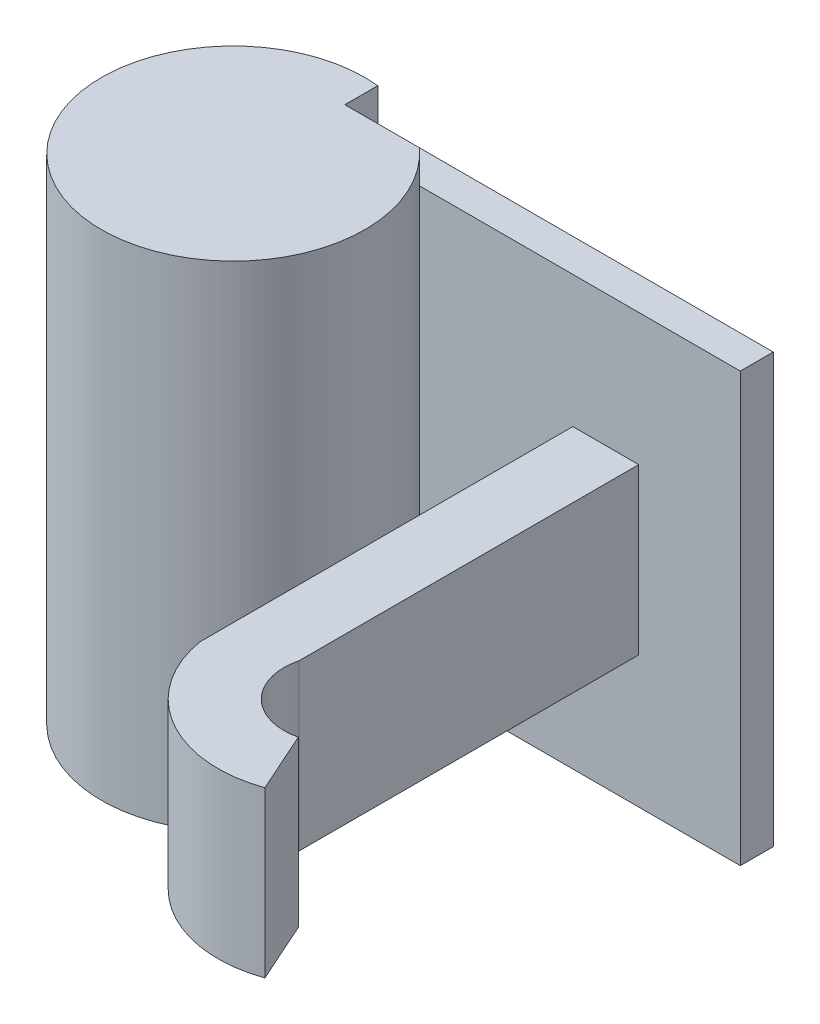
ISO-10303-21;
HEADER;
FILE_DESCRIPTION(('STEP AP214'),'2;1');
FILE_NAME('part.step','',(''),(''),'','','');
FILE_SCHEMA(('AUTOMOTIVE_DESIGN { 1 0 10303 214 1 1 1 1 }'));
ENDSEC;
DATA;
#1=APPLICATION_CONTEXT('core data for automotive mechanical design processes');
#2=APPLICATION_PROTOCOL_DEFINITION('international standard','automotive_design',2000,#1);
#3=PRODUCT_CONTEXT('',#1,'mechanical');
#4=PRODUCT('Part','Part','',(#3));
#5=PRODUCT_RELATED_PRODUCT_CATEGORY('part','',(#4));
#6=PRODUCT_DEFINITION_FORMATION('','',#4);
#7=PRODUCT_DEFINITION_CONTEXT('part definition',#1,'design');
#8=PRODUCT_DEFINITION('design','',#6,#7);
#9=PRODUCT_DEFINITION_SHAPE('','',#8);
#10=(LENGTH_UNIT() NAMED_UNIT(*) SI_UNIT(.MILLI.,.METRE.));
#11=(NAMED_UNIT(*) PLANE_ANGLE_UNIT() SI_UNIT($,.RADIAN.));
#12=(NAMED_UNIT(*) SI_UNIT($,.STERADIAN.) SOLID_ANGLE_UNIT());
#13=UNCERTAINTY_MEASURE_WITH_UNIT(LENGTH_MEASURE(1.E-05),#10,'distance_accuracy_value','');
#14=(GEOMETRIC_REPRESENTATION_CONTEXT(3) GLOBAL_UNCERTAINTY_ASSIGNED_CONTEXT((#13)) GLOBAL_UNIT_ASSIGNED_CONTEXT((#10,
#11,#12)) REPRESENTATION_CONTEXT('',''));
#15=CARTESIAN_POINT('',(0.,0.,0.));
#16=DIRECTION('',(0.,0.,1.));
#17=DIRECTION('',(1.,0.,0.));
#18=AXIS2_PLACEMENT_3D('',#15,#16,#17);
#19=CARTESIAN_POINT('',(-30.5087679770736,15.,-45.2098275623858));
#20=DIRECTION('',(0.,-1.,0.));
#21=DIRECTION('',(0.,0.,-1.));
#22=AXIS2_PLACEMENT_3D('',#19,#20,#21);
#23=CYLINDRICAL_SURFACE('',#22,4.);
#24=CARTESIAN_POINT('',(-30.5087679770736,0.,-45.2098275623858));
#25=DIRECTION('',(0.,1.,0.));
#26=DIRECTION('',(0.,0.,1.));
#27=AXIS2_PLACEMENT_3D('',#24,#25,#26);
#28=CIRCLE('',#27,4.);
#29=CARTESIAN_POINT('',(-30.0975241662523,0.,-49.1886312177653));
#30=VERTEX_POINT('',#29);
#31=CARTESIAN_POINT('',(-27.8391746030374,0.,-48.1886312177653));
#32=VERTEX_POINT('',#31);
#33=EDGE_CURVE('E205',#30,#32,#28,.T.);
#34=ORIENTED_EDGE('',*,*,#33,.T.);
#35=DIRECTION('',(0.,-1.,0.));
#36=VECTOR('',#35,1.);
#37=CARTESIAN_POINT('',(-27.8391746030374,15.,-48.1886312177653));
#38=LINE('',#37,#36);
#39=CARTESIAN_POINT('',(-27.8391746030374,1.,-48.1886312177653));
#40=VERTEX_POINT('',#39);
#41=EDGE_CURVE('E57',#40,#32,#38,.T.);
#42=ORIENTED_EDGE('',*,*,#41,.F.);
#43=DIRECTION('',(0.,-1.,0.));
#44=VECTOR('',#43,1.);
#45=CARTESIAN_POINT('',(-27.8391746030374,15.,-48.1886312177653));
#46=LINE('',#45,#44);
#47=CARTESIAN_POINT('',(-27.8391746030374,14.,-48.1886312177653));
#48=VERTEX_POINT('',#47);
#49=EDGE_CURVE('E162',#48,#40,#46,.T.);
#50=ORIENTED_EDGE('',*,*,#49,.F.);
#51=CARTESIAN_POINT('',(-27.8391746030374,15.,-48.1886312177653));
#52=VERTEX_POINT('',#51);
#53=EDGE_CURVE('E43',#52,#48,#46,.T.);
#54=ORIENTED_EDGE('',*,*,#53,.F.);
#55=CARTESIAN_POINT('',(-30.5087679770736,15.,-45.2098275623858));
#56=DIRECTION('',(0.,1.,0.));
#57=DIRECTION('',(0.,0.,1.));
#58=AXIS2_PLACEMENT_3D('',#55,#56,#57);
#59=CIRCLE('',#58,4.);
#60=CARTESIAN_POINT('',(-30.0975241662523,15.,-49.1886312177653));
#61=VERTEX_POINT('',#60);
#62=EDGE_CURVE('E208',#61,#52,#59,.T.);
#63=ORIENTED_EDGE('',*,*,#62,.F.);
#64=DIRECTION('',(0.,-1.,0.));
#65=VECTOR('',#64,1.);
#66=CARTESIAN_POINT('',(-30.0975241662523,15.,-49.1886312177653));
#67=LINE('',#66,#65);
#68=CARTESIAN_POINT('',(-30.0975241662523,14.,-49.1886312177653));
#69=VERTEX_POINT('',#68);
#70=EDGE_CURVE('E212',#61,#69,#67,.T.);
#71=ORIENTED_EDGE('',*,*,#70,.T.);
#72=CARTESIAN_POINT('',(-30.0975241662523,1.,-49.1886312177653));
#73=VERTEX_POINT('',#72);
#74=EDGE_CURVE('E210',#69,#73,#67,.T.);
#75=ORIENTED_EDGE('',*,*,#74,.T.);
#76=DIRECTION('',(0.,1.,0.));
#77=VECTOR('',#76,1.);
#78=CARTESIAN_POINT('',(-30.0975241662523,1.,-49.1886312177653));
#79=LINE('',#78,#77);
#80=EDGE_CURVE('E251',#30,#73,#79,.T.);
#81=ORIENTED_EDGE('',*,*,#80,.F.);
#82=EDGE_LOOP('',(#34,#42,#50,#54,#63,#71,#75,#81));
#83=FACE_BOUND('',#82,.T.);
#84=ADVANCED_FACE('F36',(#83),#23,.T.);
#85=CARTESIAN_POINT('',(-23.1795308481363,15.,0.));
#86=DIRECTION('',(1.,0.,0.));
#87=DIRECTION('',(0.,0.,-1.));
#88=AXIS2_PLACEMENT_3D('',#85,#86,#87);
#89=PLANE('',#88);
#90=DIRECTION('',(0.,-1.,0.));
#91=VECTOR('',#90,1.);
#92=CARTESIAN_POINT('',(-23.1795308481363,15.,-48.1886312177653));
#93=LINE('',#92,#91);
#94=CARTESIAN_POINT('',(-23.1795308481363,10.,-48.1886312177653));
#95=VERTEX_POINT('',#94);
#96=CARTESIAN_POINT('',(-23.1795308481363,5.,-48.1886312177653));
#97=VERTEX_POINT('',#96);
#98=EDGE_CURVE('E154',#95,#97,#93,.T.);
#99=ORIENTED_EDGE('',*,*,#98,.T.);
#100=DIRECTION('',(0.,0.,1.));
#101=VECTOR('',#100,1.);
#102=CARTESIAN_POINT('',(-23.1795308481363,5.,0.));
#103=LINE('',#102,#101);
#104=CARTESIAN_POINT('',(-23.1795308481363,5.,-36.8699873289625));
#105=VERTEX_POINT('',#104);
#106=EDGE_CURVE('E135',#97,#105,#103,.T.);
#107=ORIENTED_EDGE('',*,*,#106,.T.);
#108=DIRECTION('',(0.,-1.,0.));
#109=VECTOR('',#108,1.);
#110=CARTESIAN_POINT('',(-23.1795308481363,15.,-36.8699873289625));
#111=LINE('',#110,#109);
#112=CARTESIAN_POINT('',(-23.1795308481363,10.,-36.8699873289625));
#113=VERTEX_POINT('',#112);
#114=EDGE_CURVE('E163',#113,#105,#111,.T.);
#115=ORIENTED_EDGE('',*,*,#114,.F.);
#116=DIRECTION('',(0.,0.,-1.));
#117=VECTOR('',#116,1.);
#118=CARTESIAN_POINT('',(-23.1795308481363,10.,0.));
#119=LINE('',#118,#117);
#120=EDGE_CURVE('E161',#113,#95,#119,.T.);
#121=ORIENTED_EDGE('',*,*,#120,.T.);
#122=EDGE_LOOP('',(#99,#107,#115,#121));
#123=FACE_BOUND('',#122,.T.);
#124=ADVANCED_FACE('F160',(#123),#89,.F.);
#125=CARTESIAN_POINT('',(-19.5742871097638,15.,-37.4717902853478));
#126=DIRECTION('',(0.,-1.,0.));
#127=DIRECTION('',(0.,0.,-1.));
#128=AXIS2_PLACEMENT_3D('',#125,#126,#127);
#129=CYLINDRICAL_SURFACE('',#128,3.65512642891978);
#130=ORIENTED_EDGE('',*,*,#114,.T.);
#131=CARTESIAN_POINT('',(-19.5742871097638,5.,-37.4717902853478));
#132=DIRECTION('',(0.,1.,0.));
#133=DIRECTION('',(-1.,0.,0.));
#134=AXIS2_PLACEMENT_3D('',#131,#132,#133);
#135=CIRCLE('',#134,3.65512642891978);
#136=CARTESIAN_POINT('',(-18.3601178384295,5.,-34.0242198086302));
#137=VERTEX_POINT('',#136);
#138=EDGE_CURVE('E141',#105,#137,#135,.T.);
#139=ORIENTED_EDGE('',*,*,#138,.T.);
#140=DIRECTION('',(0.,-1.,0.));
#141=VECTOR('',#140,1.);
#142=CARTESIAN_POINT('',(-18.3601178384295,15.,-34.0242198086302));
#143=LINE('',#142,#141);
#144=CARTESIAN_POINT('',(-18.3601178384295,10.,-34.0242198086302));
#145=VERTEX_POINT('',#144);
#146=EDGE_CURVE('E166',#145,#137,#143,.T.);
#147=ORIENTED_EDGE('',*,*,#146,.F.);
#148=CARTESIAN_POINT('',(-19.5742871097638,10.,-37.4717902853478));
#149=DIRECTION('',(0.,-1.,0.));
#150=DIRECTION('',(0.,0.,-1.));
#151=AXIS2_PLACEMENT_3D('',#148,#149,#150);
#152=CIRCLE('',#151,3.65512642891978);
#153=EDGE_CURVE('E237',#145,#113,#152,.T.);
#154=ORIENTED_EDGE('',*,*,#153,.T.);
#155=EDGE_LOOP('',(#130,#139,#147,#154));
#156=FACE_BOUND('',#155,.T.);
#157=ADVANCED_FACE('F236',(#156),#129,.T.);
#158=CARTESIAN_POINT('',(-2.59800406845812,15.,1.16375098584307));
#159=DIRECTION('',(0.912623564366042,0.,-0.408800965952651));
#160=DIRECTION('',(-0.408800965952651,0.,-0.912623564366042));
#161=AXIS2_PLACEMENT_3D('',#158,#159,#160);
#162=PLANE('',#161);
#163=DIRECTION('',(0.408800965952651,0.,0.912623564366042));
#164=VECTOR('',#163,1.);
#165=CARTESIAN_POINT('',(-2.59800406845812,5.,1.16375098584307));
#166=LINE('',#165,#164);
#167=CARTESIAN_POINT('',(-19.1832988931057,5.,-35.8619219933266));
#168=VERTEX_POINT('',#167);
#169=EDGE_CURVE('E232',#168,#137,#166,.T.);
#170=ORIENTED_EDGE('',*,*,#169,.F.);
#171=DIRECTION('',(0.,-1.,0.));
#172=VECTOR('',#171,1.);
#173=CARTESIAN_POINT('',(-19.1832988931057,15.,-35.8619219933266));
#174=LINE('',#173,#172);
#175=CARTESIAN_POINT('',(-19.1832988931057,10.,-35.8619219933266));
#176=VERTEX_POINT('',#175);
#177=EDGE_CURVE('E223',#176,#168,#174,.T.);
#178=ORIENTED_EDGE('',*,*,#177,.F.);
#179=DIRECTION('',(-0.408800965952651,0.,-0.912623564366042));
#180=VECTOR('',#179,1.);
#181=CARTESIAN_POINT('',(-2.59800406845812,10.,1.16375098584307));
#182=LINE('',#181,#180);
#183=EDGE_CURVE('E233',#145,#176,#182,.T.);
#184=ORIENTED_EDGE('',*,*,#183,.F.);
#185=ORIENTED_EDGE('',*,*,#146,.T.);
#186=EDGE_LOOP('',(#170,#178,#184,#185));
#187=FACE_BOUND('',#186,.T.);
#188=ADVANCED_FACE('F230',(#187),#162,.T.);
#189=CARTESIAN_POINT('',(-19.5742871097638,15.,-37.4717902853478));
#190=DIRECTION('',(0.,-1.,0.));
#191=DIRECTION('',(0.,0.,-1.));
#192=AXIS2_PLACEMENT_3D('',#189,#190,#191);
#193=CYLINDRICAL_SURFACE('',#192,1.65666765020046);
#194=CARTESIAN_POINT('',(-19.5742871097638,5.,-37.4717902853478));
#195=DIRECTION('',(0.,1.,0.));
#196=DIRECTION('',(-1.,0.,0.));
#197=AXIS2_PLACEMENT_3D('',#194,#195,#196);
#198=CIRCLE('',#197,1.65666765020046);
#199=CARTESIAN_POINT('',(-21.1795308481363,5.,-37.8813513230904));
#200=VERTEX_POINT('',#199);
#201=EDGE_CURVE('E239',#200,#168,#198,.T.);
#202=ORIENTED_EDGE('',*,*,#201,.F.);
#203=DIRECTION('',(0.,-1.,0.));
#204=VECTOR('',#203,1.);
#205=CARTESIAN_POINT('',(-21.1795308481363,15.,-37.8813513230904));
#206=LINE('',#205,#204);
#207=CARTESIAN_POINT('',(-21.1795308481363,10.,-37.8813513230904));
#208=VERTEX_POINT('',#207);
#209=EDGE_CURVE('E220',#208,#200,#206,.T.);
#210=ORIENTED_EDGE('',*,*,#209,.F.);
#211=CARTESIAN_POINT('',(-19.5742871097638,10.,-37.4717902853478));
#212=DIRECTION('',(0.,-1.,0.));
#213=DIRECTION('',(0.,0.,-1.));
#214=AXIS2_PLACEMENT_3D('',#211,#212,#213);
#215=CIRCLE('',#214,1.65666765020046);
#216=EDGE_CURVE('E246',#176,#208,#215,.T.);
#217=ORIENTED_EDGE('',*,*,#216,.F.);
#218=ORIENTED_EDGE('',*,*,#177,.T.);
#219=EDGE_LOOP('',(#202,#210,#217,#218));
#220=FACE_BOUND('',#219,.T.);
#221=ADVANCED_FACE('F311',(#220),#193,.F.);
#222=CARTESIAN_POINT('',(-21.1795308481363,15.,0.));
#223=DIRECTION('',(1.,0.,0.));
#224=DIRECTION('',(0.,0.,-1.));
#225=AXIS2_PLACEMENT_3D('',#222,#223,#224);
#226=PLANE('',#225);
#227=DIRECTION('',(0.,0.,1.));
#228=VECTOR('',#227,1.);
#229=CARTESIAN_POINT('',(-21.1795308481363,5.,0.));
#230=LINE('',#229,#228);
#231=CARTESIAN_POINT('',(-21.1795308481363,5.,-48.1886312177653));
#232=VERTEX_POINT('',#231);
#233=EDGE_CURVE('E157',#232,#200,#230,.T.);
#234=ORIENTED_EDGE('',*,*,#233,.F.);
#235=DIRECTION('',(0.,-1.,0.));
#236=VECTOR('',#235,1.);
#237=CARTESIAN_POINT('',(-21.1795308481363,15.,-48.1886312177653));
#238=LINE('',#237,#236);
#239=CARTESIAN_POINT('',(-21.1795308481363,10.,-48.1886312177653));
#240=VERTEX_POINT('',#239);
#241=EDGE_CURVE('E156',#240,#232,#238,.T.);
#242=ORIENTED_EDGE('',*,*,#241,.F.);
#243=DIRECTION('',(0.,0.,-1.));
#244=VECTOR('',#243,1.);
#245=CARTESIAN_POINT('',(-21.1795308481363,10.,0.));
#246=LINE('',#245,#244);
#247=EDGE_CURVE('E244',#208,#240,#246,.T.);
#248=ORIENTED_EDGE('',*,*,#247,.F.);
#249=ORIENTED_EDGE('',*,*,#209,.T.);
#250=EDGE_LOOP('',(#234,#242,#248,#249));
#251=FACE_BOUND('',#250,.T.);
#252=ADVANCED_FACE('F314',(#251),#226,.T.);
#253=CARTESIAN_POINT('',(0.,15.,-48.1886312177653));
#254=DIRECTION('',(0.,0.,-1.));
#255=DIRECTION('',(-1.,0.,0.));
#256=AXIS2_PLACEMENT_3D('',#253,#254,#255);
#257=PLANE('',#256);
#258=DIRECTION('',(1.,0.,0.));
#259=VECTOR('',#258,1.);
#260=CARTESIAN_POINT('',(-23.7626173007475,5.,-48.1886312177653));
#261=LINE('',#260,#259);
#262=EDGE_CURVE('E138',#97,#232,#261,.T.);
#263=ORIENTED_EDGE('',*,*,#262,.F.);
#264=ORIENTED_EDGE('',*,*,#98,.F.);
#265=DIRECTION('',(-1.,0.,0.));
#266=VECTOR('',#265,1.);
#267=CARTESIAN_POINT('',(-23.8144847021208,10.,-48.1886312177653));
#268=LINE('',#267,#266);
#269=EDGE_CURVE('E146',#240,#95,#268,.T.);
#270=ORIENTED_EDGE('',*,*,#269,.F.);
#271=ORIENTED_EDGE('',*,*,#241,.T.);
#272=EDGE_LOOP('',(#263,#264,#270,#271));
#273=FACE_BOUND('',#272,.T.);
#274=DIRECTION('',(1.,0.,0.));
#275=VECTOR('',#274,1.);
#276=CARTESIAN_POINT('',(-18.0975241662523,1.,-48.1886312177653));
#277=LINE('',#276,#275);
#278=CARTESIAN_POINT('',(-18.0975241662523,1.,-48.1886312177653));
#279=VERTEX_POINT('',#278);
#280=EDGE_CURVE('E192',#40,#279,#277,.T.);
#281=ORIENTED_EDGE('',*,*,#280,.T.);
#282=DIRECTION('',(0.,-1.,0.));
#283=VECTOR('',#282,1.);
#284=CARTESIAN_POINT('',(-18.0975241662523,15.,-48.1886312177653));
#285=LINE('',#284,#283);
#286=CARTESIAN_POINT('',(-18.0975241662523,14.,-48.1886312177653));
#287=VERTEX_POINT('',#286);
#288=EDGE_CURVE('E194',#287,#279,#285,.T.);
#289=ORIENTED_EDGE('',*,*,#288,.F.);
#290=DIRECTION('',(-1.,0.,0.));
#291=VECTOR('',#290,1.);
#292=CARTESIAN_POINT('',(-18.0975241662523,14.,-48.1886312177653));
#293=LINE('',#292,#291);
#294=EDGE_CURVE('E184',#287,#48,#293,.T.);
#295=ORIENTED_EDGE('',*,*,#294,.T.);
#296=ORIENTED_EDGE('',*,*,#49,.T.);
#297=EDGE_LOOP('',(#281,#289,#295,#296));
#298=FACE_BOUND('',#297,.T.);
#299=ADVANCED_FACE('F151',(#273,#298),#257,.F.);
#300=CARTESIAN_POINT('',(-18.0975241662523,15.,0.));
#301=DIRECTION('',(1.,0.,0.));
#302=DIRECTION('',(0.,0.,-1.));
#303=AXIS2_PLACEMENT_3D('',#300,#301,#302);
#304=PLANE('',#303);
#305=DIRECTION('',(0.,0.,-1.));
#306=VECTOR('',#305,1.);
#307=CARTESIAN_POINT('',(-18.0975241662523,1.,-48.1886312177653));
#308=LINE('',#307,#306);
#309=CARTESIAN_POINT('',(-18.0975241662523,1.,-49.1886312177653));
#310=VERTEX_POINT('',#309);
#311=EDGE_CURVE('E262',#279,#310,#308,.T.);
#312=ORIENTED_EDGE('',*,*,#311,.T.);
#313=DIRECTION('',(0.,-1.,0.));
#314=VECTOR('',#313,1.);
#315=CARTESIAN_POINT('',(-18.0975241662523,15.,-49.1886312177653));
#316=LINE('',#315,#314);
#317=CARTESIAN_POINT('',(-18.0975241662523,14.,-49.1886312177653));
#318=VERTEX_POINT('',#317);
#319=EDGE_CURVE('E215',#318,#310,#316,.T.);
#320=ORIENTED_EDGE('',*,*,#319,.F.);
#321=DIRECTION('',(0.,0.,-1.));
#322=VECTOR('',#321,1.);
#323=CARTESIAN_POINT('',(-18.0975241662523,14.,-48.1886312177653));
#324=LINE('',#323,#322);
#325=EDGE_CURVE('E200',#287,#318,#324,.T.);
#326=ORIENTED_EDGE('',*,*,#325,.F.);
#327=ORIENTED_EDGE('',*,*,#288,.T.);
#328=EDGE_LOOP('',(#312,#320,#326,#327));
#329=FACE_BOUND('',#328,.T.);
#330=ADVANCED_FACE('F283',(#329),#304,.T.);
#331=CARTESIAN_POINT('',(0.,15.,-49.1886312177653));
#332=DIRECTION('',(0.,0.,-1.));
#333=DIRECTION('',(-1.,0.,0.));
#334=AXIS2_PLACEMENT_3D('',#331,#332,#333);
#335=PLANE('',#334);
#336=DIRECTION('',(1.,0.,0.));
#337=VECTOR('',#336,1.);
#338=CARTESIAN_POINT('',(-18.0975241662523,1.,-49.1886312177653));
#339=LINE('',#338,#337);
#340=EDGE_CURVE('E255',#73,#310,#339,.T.);
#341=ORIENTED_EDGE('',*,*,#340,.F.);
#342=ORIENTED_EDGE('',*,*,#74,.F.);
#343=DIRECTION('',(-1.,0.,0.));
#344=VECTOR('',#343,1.);
#345=CARTESIAN_POINT('',(-18.0975241662523,14.,-49.1886312177653));
#346=LINE('',#345,#344);
#347=EDGE_CURVE('E187',#318,#69,#346,.T.);
#348=ORIENTED_EDGE('',*,*,#347,.F.);
#349=ORIENTED_EDGE('',*,*,#319,.T.);
#350=EDGE_LOOP('',(#341,#342,#348,#349));
#351=FACE_BOUND('',#350,.T.);
#352=ADVANCED_FACE('F286',(#351),#335,.T.);
#353=CARTESIAN_POINT('',(0.,15.,0.));
#354=DIRECTION('',(0.,1.,0.));
#355=DIRECTION('',(0.,0.,1.));
#356=AXIS2_PLACEMENT_3D('',#353,#354,#355);
#357=PLANE('',#356);
#358=DIRECTION('',(0.,0.,-1.));
#359=VECTOR('',#358,1.);
#360=CARTESIAN_POINT('',(-30.0975241662523,15.,-48.1886312177653));
#361=LINE('',#360,#359);
#362=CARTESIAN_POINT('',(-30.0975241662523,15.,-48.1886312177653));
#363=VERTEX_POINT('',#362);
#364=EDGE_CURVE('E202',#363,#61,#361,.T.);
#365=ORIENTED_EDGE('',*,*,#364,.T.);
#366=ORIENTED_EDGE('',*,*,#62,.T.);
#367=DIRECTION('',(1.,0.,0.));
#368=VECTOR('',#367,1.);
#369=CARTESIAN_POINT('',(-18.0975241662523,15.,-48.1886312177653));
#370=LINE('',#369,#368);
#371=EDGE_CURVE('E176',#363,#52,#370,.T.);
#372=ORIENTED_EDGE('',*,*,#371,.F.);
#373=EDGE_LOOP('',(#365,#366,#372));
#374=FACE_BOUND('',#373,.T.);
#375=ADVANCED_FACE('F290',(#374),#357,.T.);
#376=CARTESIAN_POINT('',(0.,0.,0.));
#377=DIRECTION('',(0.,1.,0.));
#378=DIRECTION('',(0.,0.,1.));
#379=AXIS2_PLACEMENT_3D('',#376,#377,#378);
#380=PLANE('',#379);
#381=ORIENTED_EDGE('',*,*,#33,.F.);
#382=DIRECTION('',(0.,0.,-1.));
#383=VECTOR('',#382,1.);
#384=CARTESIAN_POINT('',(-30.0975241662523,0.,-48.1886312177653));
#385=LINE('',#384,#383);
#386=CARTESIAN_POINT('',(-30.0975241662523,0.,-48.1886312177653));
#387=VERTEX_POINT('',#386);
#388=EDGE_CURVE('E258',#387,#30,#385,.T.);
#389=ORIENTED_EDGE('',*,*,#388,.F.);
#390=DIRECTION('',(-1.,0.,0.));
#391=VECTOR('',#390,1.);
#392=CARTESIAN_POINT('',(0.,0.,-48.1886312177653));
#393=LINE('',#392,#391);
#394=EDGE_CURVE('E11',#32,#387,#393,.T.);
#395=ORIENTED_EDGE('',*,*,#394,.F.);
#396=EDGE_LOOP('',(#381,#389,#395));
#397=FACE_BOUND('',#396,.T.);
#398=ADVANCED_FACE('F276',(#397),#380,.F.);
#399=CARTESIAN_POINT('',(0.,0.,-48.1886312177653));
#400=DIRECTION('',(0.,0.,-1.));
#401=DIRECTION('',(-1.,0.,0.));
#402=AXIS2_PLACEMENT_3D('',#399,#400,#401);
#403=PLANE('',#402);
#404=ORIENTED_EDGE('',*,*,#53,.T.);
#405=CARTESIAN_POINT('',(-30.0975241662523,14.,-48.1886312177653));
#406=VERTEX_POINT('',#405);
#407=EDGE_CURVE('E173',#48,#406,#293,.T.);
#408=ORIENTED_EDGE('',*,*,#407,.T.);
#409=DIRECTION('',(0.,1.,0.));
#410=VECTOR('',#409,1.);
#411=CARTESIAN_POINT('',(-30.0975241662523,15.,-48.1886312177653));
#412=LINE('',#411,#410);
#413=EDGE_CURVE('E50',#406,#363,#412,.T.);
#414=ORIENTED_EDGE('',*,*,#413,.T.);
#415=ORIENTED_EDGE('',*,*,#371,.T.);
#416=EDGE_LOOP('',(#404,#408,#414,#415));
#417=FACE_BOUND('',#416,.T.);
#418=ADVANCED_FACE('F172',(#417),#403,.T.);
#419=CARTESIAN_POINT('',(-30.0975241662523,15.,-48.1886312177653));
#420=DIRECTION('',(-1.,0.,0.));
#421=DIRECTION('',(0.,0.,1.));
#422=AXIS2_PLACEMENT_3D('',#419,#420,#421);
#423=PLANE('',#422);
#424=ORIENTED_EDGE('',*,*,#70,.F.);
#425=ORIENTED_EDGE('',*,*,#364,.F.);
#426=ORIENTED_EDGE('',*,*,#413,.F.);
#427=DIRECTION('',(0.,0.,-1.));
#428=VECTOR('',#427,1.);
#429=CARTESIAN_POINT('',(-30.0975241662523,14.,-48.1886312177653));
#430=LINE('',#429,#428);
#431=EDGE_CURVE('E186',#406,#69,#430,.T.);
#432=ORIENTED_EDGE('',*,*,#431,.T.);
#433=EDGE_LOOP('',(#424,#425,#426,#432));
#434=FACE_BOUND('',#433,.T.);
#435=ADVANCED_FACE('F288',(#434),#423,.F.);
#436=CARTESIAN_POINT('',(-18.0975241662523,14.,-48.1886312177653));
#437=DIRECTION('',(0.,-1.,0.));
#438=DIRECTION('',(0.,0.,-1.));
#439=AXIS2_PLACEMENT_3D('',#436,#437,#438);
#440=PLANE('',#439);
#441=ORIENTED_EDGE('',*,*,#347,.T.);
#442=ORIENTED_EDGE('',*,*,#431,.F.);
#443=ORIENTED_EDGE('',*,*,#407,.F.);
#444=ORIENTED_EDGE('',*,*,#294,.F.);
#445=ORIENTED_EDGE('',*,*,#325,.T.);
#446=EDGE_LOOP('',(#441,#442,#443,#444,#445));
#447=FACE_BOUND('',#446,.T.);
#448=ADVANCED_FACE('F183',(#447),#440,.F.);
#449=CARTESIAN_POINT('',(0.,0.,-48.1886312177653));
#450=DIRECTION('',(0.,0.,-1.));
#451=DIRECTION('',(-1.,0.,0.));
#452=AXIS2_PLACEMENT_3D('',#449,#450,#451);
#453=PLANE('',#452);
#454=ORIENTED_EDGE('',*,*,#41,.T.);
#455=ORIENTED_EDGE('',*,*,#394,.T.);
#456=DIRECTION('',(0.,1.,0.));
#457=VECTOR('',#456,1.);
#458=CARTESIAN_POINT('',(-30.0975241662523,1.,-48.1886312177653));
#459=LINE('',#458,#457);
#460=CARTESIAN_POINT('',(-30.0975241662523,1.,-48.1886312177653));
#461=VERTEX_POINT('',#460);
#462=EDGE_CURVE('E252',#387,#461,#459,.T.);
#463=ORIENTED_EDGE('',*,*,#462,.T.);
#464=EDGE_CURVE('E256',#461,#40,#277,.T.);
#465=ORIENTED_EDGE('',*,*,#464,.T.);
#466=EDGE_LOOP('',(#454,#455,#463,#465));
#467=FACE_BOUND('',#466,.T.);
#468=ADVANCED_FACE('F277',(#467),#453,.T.);
#469=CARTESIAN_POINT('',(-18.0975241662523,1.,-48.1886312177653));
#470=DIRECTION('',(0.,1.,0.));
#471=DIRECTION('',(0.,0.,1.));
#472=AXIS2_PLACEMENT_3D('',#469,#470,#471);
#473=PLANE('',#472);
#474=ORIENTED_EDGE('',*,*,#340,.T.);
#475=ORIENTED_EDGE('',*,*,#311,.F.);
#476=ORIENTED_EDGE('',*,*,#280,.F.);
#477=ORIENTED_EDGE('',*,*,#464,.F.);
#478=DIRECTION('',(0.,0.,-1.));
#479=VECTOR('',#478,1.);
#480=CARTESIAN_POINT('',(-30.0975241662523,1.,-48.1886312177653));
#481=LINE('',#480,#479);
#482=EDGE_CURVE('E265',#461,#73,#481,.T.);
#483=ORIENTED_EDGE('',*,*,#482,.T.);
#484=EDGE_LOOP('',(#474,#475,#476,#477,#483));
#485=FACE_BOUND('',#484,.T.);
#486=ADVANCED_FACE('F280',(#485),#473,.F.);
#487=CARTESIAN_POINT('',(-30.0975241662523,1.,-48.1886312177653));
#488=DIRECTION('',(-1.,0.,0.));
#489=DIRECTION('',(0.,0.,1.));
#490=AXIS2_PLACEMENT_3D('',#487,#488,#489);
#491=PLANE('',#490);
#492=ORIENTED_EDGE('',*,*,#80,.T.);
#493=ORIENTED_EDGE('',*,*,#482,.F.);
#494=ORIENTED_EDGE('',*,*,#462,.F.);
#495=ORIENTED_EDGE('',*,*,#388,.T.);
#496=EDGE_LOOP('',(#492,#493,#494,#495));
#497=FACE_BOUND('',#496,.T.);
#498=ADVANCED_FACE('F270',(#497),#491,.F.);
#499=CARTESIAN_POINT('',(-23.8144847021208,10.,-27.1886312177653));
#500=DIRECTION('',(0.,-1.,0.));
#501=DIRECTION('',(0.,0.,-1.));
#502=AXIS2_PLACEMENT_3D('',#499,#500,#501);
#503=PLANE('',#502);
#504=ORIENTED_EDGE('',*,*,#153,.F.);
#505=ORIENTED_EDGE('',*,*,#183,.T.);
#506=ORIENTED_EDGE('',*,*,#216,.T.);
#507=ORIENTED_EDGE('',*,*,#247,.T.);
#508=ORIENTED_EDGE('',*,*,#269,.T.);
#509=ORIENTED_EDGE('',*,*,#120,.F.);
#510=EDGE_LOOP('',(#504,#505,#506,#507,#508,#509));
#511=FACE_BOUND('',#510,.T.);
#512=ADVANCED_FACE('F383',(#511),#503,.F.);
#513=CARTESIAN_POINT('',(-23.7626173007475,5.,-27.1886312177653));
#514=DIRECTION('',(0.,1.,0.));
#515=DIRECTION('',(-1.,0.,0.));
#516=AXIS2_PLACEMENT_3D('',#513,#514,#515);
#517=PLANE('',#516);
#518=ORIENTED_EDGE('',*,*,#262,.T.);
#519=ORIENTED_EDGE('',*,*,#233,.T.);
#520=ORIENTED_EDGE('',*,*,#201,.T.);
#521=ORIENTED_EDGE('',*,*,#169,.T.);
#522=ORIENTED_EDGE('',*,*,#138,.F.);
#523=ORIENTED_EDGE('',*,*,#106,.F.);
#524=EDGE_LOOP('',(#518,#519,#520,#521,#522,#523));
#525=FACE_BOUND('',#524,.T.);
#526=ADVANCED_FACE('F137',(#525),#517,.F.);
#527=CLOSED_SHELL('',(#84,#124,#157,#188,#221,#252,#299,#330,#352,#375,#398,#418,#435,#448,#468,
#486,#498,#512,#526));
#528=MANIFOLD_SOLID_BREP('B2',#527);
#529=ADVANCED_BREP_SHAPE_REPRESENTATION('',(#18,#528),#14);
#530=SHAPE_DEFINITION_REPRESENTATION(#9,#529);
ENDSEC;
END-ISO-10303-21;
